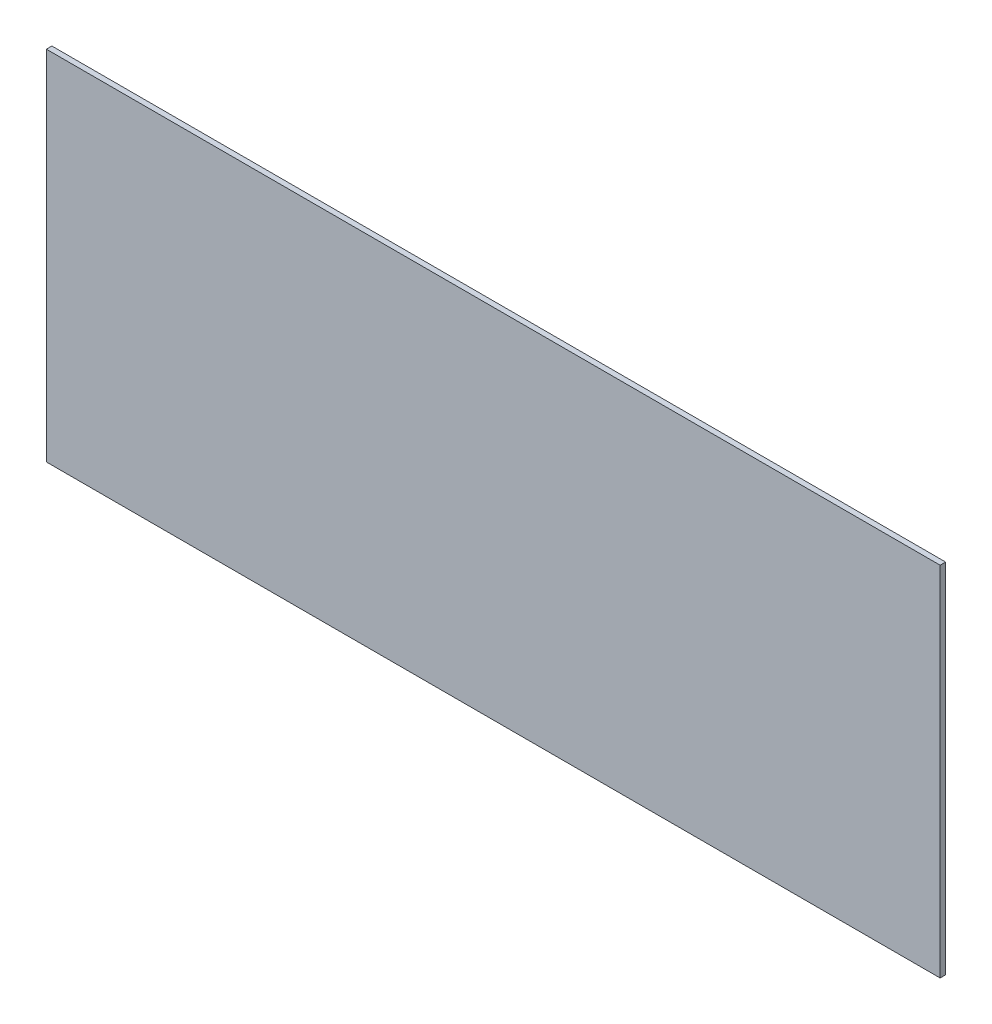
ISO-10303-21;
HEADER;
FILE_DESCRIPTION(('STEP AP214'),'2;1');
FILE_NAME('part.step','',(''),(''),'','','');
FILE_SCHEMA(('AUTOMOTIVE_DESIGN { 1 0 10303 214 1 1 1 1 }'));
ENDSEC;
DATA;
#1=APPLICATION_CONTEXT('core data for automotive mechanical design processes');
#2=APPLICATION_PROTOCOL_DEFINITION('international standard','automotive_design',2000,#1);
#3=PRODUCT_CONTEXT('',#1,'mechanical');
#4=PRODUCT('Part','Part','',(#3));
#5=PRODUCT_RELATED_PRODUCT_CATEGORY('part','',(#4));
#6=PRODUCT_DEFINITION_FORMATION('','',#4);
#7=PRODUCT_DEFINITION_CONTEXT('part definition',#1,'design');
#8=PRODUCT_DEFINITION('design','',#6,#7);
#9=PRODUCT_DEFINITION_SHAPE('','',#8);
#10=(LENGTH_UNIT() NAMED_UNIT(*) SI_UNIT(.MILLI.,.METRE.));
#11=(NAMED_UNIT(*) PLANE_ANGLE_UNIT() SI_UNIT($,.RADIAN.));
#12=(NAMED_UNIT(*) SI_UNIT($,.STERADIAN.) SOLID_ANGLE_UNIT());
#13=UNCERTAINTY_MEASURE_WITH_UNIT(LENGTH_MEASURE(1.E-05),#10,'distance_accuracy_value','');
#14=(GEOMETRIC_REPRESENTATION_CONTEXT(3) GLOBAL_UNCERTAINTY_ASSIGNED_CONTEXT((#13)) GLOBAL_UNIT_ASSIGNED_CONTEXT((#10,
#11,#12)) REPRESENTATION_CONTEXT('',''));
#15=CARTESIAN_POINT('',(0.,0.,0.));
#16=DIRECTION('',(0.,0.,1.));
#17=DIRECTION('',(1.,0.,0.));
#18=AXIS2_PLACEMENT_3D('',#15,#16,#17);
#19=CARTESIAN_POINT('',(-118.208808224359,16.5000000000001,0.8));
#20=DIRECTION('',(1.,0.,0.));
#21=DIRECTION('',(0.,0.,-1.));
#22=AXIS2_PLACEMENT_3D('',#19,#20,#21);
#23=PLANE('',#22);
#24=DIRECTION('',(0.,-1.,0.));
#25=VECTOR('',#24,1.);
#26=CARTESIAN_POINT('',(-118.208808224359,16.5000000000001,0.));
#27=LINE('',#26,#25);
#28=CARTESIAN_POINT('',(-118.208808224359,16.5000000000001,0.));
#29=VERTEX_POINT('',#28);
#30=CARTESIAN_POINT('',(-118.208808224359,-35.4999999999999,0.));
#31=VERTEX_POINT('',#30);
#32=EDGE_CURVE('E96',#29,#31,#27,.T.);
#33=ORIENTED_EDGE('',*,*,#32,.T.);
#34=DIRECTION('',(0.,0.,-1.));
#35=VECTOR('',#34,1.);
#36=CARTESIAN_POINT('',(-118.208808224359,-35.4999999999999,0.8));
#37=LINE('',#36,#35);
#38=CARTESIAN_POINT('',(-118.208808224359,-35.4999999999999,0.8));
#39=VERTEX_POINT('',#38);
#40=EDGE_CURVE('E11',#39,#31,#37,.T.);
#41=ORIENTED_EDGE('',*,*,#40,.F.);
#42=DIRECTION('',(0.,-1.,0.));
#43=VECTOR('',#42,1.);
#44=CARTESIAN_POINT('',(-118.208808224359,16.5000000000001,0.8));
#45=LINE('',#44,#43);
#46=CARTESIAN_POINT('',(-118.208808224359,16.5000000000001,0.8));
#47=VERTEX_POINT('',#46);
#48=EDGE_CURVE('E84',#47,#39,#45,.T.);
#49=ORIENTED_EDGE('',*,*,#48,.F.);
#50=DIRECTION('',(0.,0.,-1.));
#51=VECTOR('',#50,1.);
#52=CARTESIAN_POINT('',(-118.208808224359,16.5000000000001,0.8));
#53=LINE('',#52,#51);
#54=EDGE_CURVE('E92',#47,#29,#53,.T.);
#55=ORIENTED_EDGE('',*,*,#54,.T.);
#56=EDGE_LOOP('',(#33,#41,#49,#55));
#57=FACE_BOUND('',#56,.T.);
#58=ADVANCED_FACE('F33',(#57),#23,.F.);
#59=CARTESIAN_POINT('',(-118.208808224359,-35.4999999999999,0.8));
#60=DIRECTION('',(0.,1.,0.));
#61=DIRECTION('',(0.,0.,1.));
#62=AXIS2_PLACEMENT_3D('',#59,#60,#61);
#63=PLANE('',#62);
#64=DIRECTION('',(1.,0.,0.));
#65=VECTOR('',#64,1.);
#66=CARTESIAN_POINT('',(-118.208808224359,-35.4999999999999,0.));
#67=LINE('',#66,#65);
#68=CARTESIAN_POINT('',(11.7911917756414,-35.4999999999999,0.));
#69=VERTEX_POINT('',#68);
#70=EDGE_CURVE('E88',#31,#69,#67,.T.);
#71=ORIENTED_EDGE('',*,*,#70,.T.);
#72=DIRECTION('',(0.,0.,-1.));
#73=VECTOR('',#72,1.);
#74=CARTESIAN_POINT('',(11.7911917756414,-35.4999999999999,0.8));
#75=LINE('',#74,#73);
#76=CARTESIAN_POINT('',(11.7911917756414,-35.4999999999999,0.8));
#77=VERTEX_POINT('',#76);
#78=EDGE_CURVE('E41',#77,#69,#75,.T.);
#79=ORIENTED_EDGE('',*,*,#78,.F.);
#80=DIRECTION('',(1.,0.,0.));
#81=VECTOR('',#80,1.);
#82=CARTESIAN_POINT('',(-118.208808224359,-35.4999999999999,0.8));
#83=LINE('',#82,#81);
#84=EDGE_CURVE('E79',#39,#77,#83,.T.);
#85=ORIENTED_EDGE('',*,*,#84,.F.);
#86=ORIENTED_EDGE('',*,*,#40,.T.);
#87=EDGE_LOOP('',(#71,#79,#85,#86));
#88=FACE_BOUND('',#87,.T.);
#89=ADVANCED_FACE('F87',(#88),#63,.F.);
#90=CARTESIAN_POINT('',(11.7911917756414,16.5000000000001,0.8));
#91=DIRECTION('',(-1.,0.,0.));
#92=DIRECTION('',(0.,-1.,0.));
#93=AXIS2_PLACEMENT_3D('',#90,#91,#92);
#94=PLANE('',#93);
#95=DIRECTION('',(0.,1.,0.));
#96=VECTOR('',#95,1.);
#97=CARTESIAN_POINT('',(11.7911917756414,16.5000000000001,0.));
#98=LINE('',#97,#96);
#99=CARTESIAN_POINT('',(11.7911917756414,16.5000000000001,0.));
#100=VERTEX_POINT('',#99);
#101=EDGE_CURVE('E66',#69,#100,#98,.T.);
#102=ORIENTED_EDGE('',*,*,#101,.T.);
#103=DIRECTION('',(0.,0.,-1.));
#104=VECTOR('',#103,1.);
#105=CARTESIAN_POINT('',(11.7911917756414,16.5000000000001,0.8));
#106=LINE('',#105,#104);
#107=CARTESIAN_POINT('',(11.7911917756414,16.5000000000001,0.8));
#108=VERTEX_POINT('',#107);
#109=EDGE_CURVE('E89',#108,#100,#106,.T.);
#110=ORIENTED_EDGE('',*,*,#109,.F.);
#111=DIRECTION('',(0.,1.,0.));
#112=VECTOR('',#111,1.);
#113=CARTESIAN_POINT('',(11.7911917756414,16.5000000000001,0.8));
#114=LINE('',#113,#112);
#115=EDGE_CURVE('E82',#77,#108,#114,.T.);
#116=ORIENTED_EDGE('',*,*,#115,.F.);
#117=ORIENTED_EDGE('',*,*,#78,.T.);
#118=EDGE_LOOP('',(#102,#110,#116,#117));
#119=FACE_BOUND('',#118,.T.);
#120=ADVANCED_FACE('F90',(#119),#94,.F.);
#121=CARTESIAN_POINT('',(-118.208808224359,16.5000000000001,0.8));
#122=DIRECTION('',(0.,-1.,0.));
#123=DIRECTION('',(0.,0.,-1.));
#124=AXIS2_PLACEMENT_3D('',#121,#122,#123);
#125=PLANE('',#124);
#126=DIRECTION('',(-1.,0.,0.));
#127=VECTOR('',#126,1.);
#128=CARTESIAN_POINT('',(-118.208808224359,16.5000000000001,0.));
#129=LINE('',#128,#127);
#130=EDGE_CURVE('E72',#100,#29,#129,.T.);
#131=ORIENTED_EDGE('',*,*,#130,.T.);
#132=ORIENTED_EDGE('',*,*,#54,.F.);
#133=DIRECTION('',(-1.,0.,0.));
#134=VECTOR('',#133,1.);
#135=CARTESIAN_POINT('',(-118.208808224359,16.5000000000001,0.8));
#136=LINE('',#135,#134);
#137=EDGE_CURVE('E49',#108,#47,#136,.T.);
#138=ORIENTED_EDGE('',*,*,#137,.F.);
#139=ORIENTED_EDGE('',*,*,#109,.T.);
#140=EDGE_LOOP('',(#131,#132,#138,#139));
#141=FACE_BOUND('',#140,.T.);
#142=ADVANCED_FACE('F103',(#141),#125,.F.);
#143=CARTESIAN_POINT('',(0.,0.,0.8));
#144=DIRECTION('',(0.,0.,1.));
#145=DIRECTION('',(1.,0.,0.));
#146=AXIS2_PLACEMENT_3D('',#143,#144,#145);
#147=PLANE('',#146);
#148=ORIENTED_EDGE('',*,*,#48,.T.);
#149=ORIENTED_EDGE('',*,*,#84,.T.);
#150=ORIENTED_EDGE('',*,*,#115,.T.);
#151=ORIENTED_EDGE('',*,*,#137,.T.);
#152=EDGE_LOOP('',(#148,#149,#150,#151));
#153=FACE_BOUND('',#152,.T.);
#154=ADVANCED_FACE('F80',(#153),#147,.T.);
#155=CARTESIAN_POINT('',(0.,0.,0.));
#156=DIRECTION('',(0.,0.,1.));
#157=DIRECTION('',(1.,0.,0.));
#158=AXIS2_PLACEMENT_3D('',#155,#156,#157);
#159=PLANE('',#158);
#160=ORIENTED_EDGE('',*,*,#32,.F.);
#161=ORIENTED_EDGE('',*,*,#130,.F.);
#162=ORIENTED_EDGE('',*,*,#101,.F.);
#163=ORIENTED_EDGE('',*,*,#70,.F.);
#164=EDGE_LOOP('',(#160,#161,#162,#163));
#165=FACE_BOUND('',#164,.T.);
#166=ADVANCED_FACE('F106',(#165),#159,.F.);
#167=CLOSED_SHELL('',(#58,#89,#120,#142,#154,#166));
#168=MANIFOLD_SOLID_BREP('B2',#167);
#169=ADVANCED_BREP_SHAPE_REPRESENTATION('',(#18,#168),#14);
#170=SHAPE_DEFINITION_REPRESENTATION(#9,#169);
ENDSEC;
END-ISO-10303-21;
